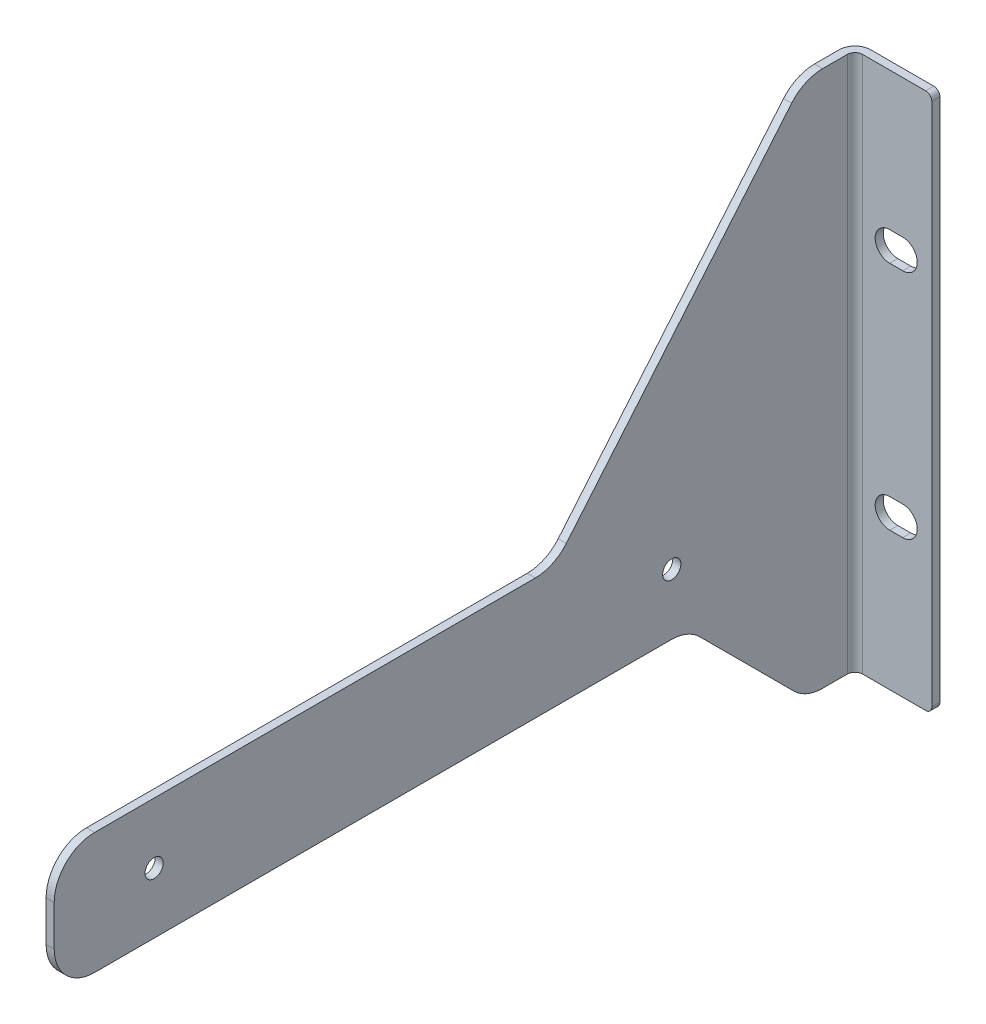
ISO-10303-21;
HEADER;
FILE_DESCRIPTION(('STEP AP214'),'2;1');
FILE_NAME('part.step','',(''),(''),'','','');
FILE_SCHEMA(('AUTOMOTIVE_DESIGN { 1 0 10303 214 1 1 1 1 }'));
ENDSEC;
DATA;
#1=APPLICATION_CONTEXT('core data for automotive mechanical design processes');
#2=APPLICATION_PROTOCOL_DEFINITION('international standard','automotive_design',2000,#1);
#3=PRODUCT_CONTEXT('',#1,'mechanical');
#4=PRODUCT('Part','Part','',(#3));
#5=PRODUCT_RELATED_PRODUCT_CATEGORY('part','',(#4));
#6=PRODUCT_DEFINITION_FORMATION('','',#4);
#7=PRODUCT_DEFINITION_CONTEXT('part definition',#1,'design');
#8=PRODUCT_DEFINITION('design','',#6,#7);
#9=PRODUCT_DEFINITION_SHAPE('','',#8);
#10=(LENGTH_UNIT() NAMED_UNIT(*) SI_UNIT(.MILLI.,.METRE.));
#11=(NAMED_UNIT(*) PLANE_ANGLE_UNIT() SI_UNIT($,.RADIAN.));
#12=(NAMED_UNIT(*) SI_UNIT($,.STERADIAN.) SOLID_ANGLE_UNIT());
#13=UNCERTAINTY_MEASURE_WITH_UNIT(LENGTH_MEASURE(1.E-05),#10,'distance_accuracy_value','');
#14=(GEOMETRIC_REPRESENTATION_CONTEXT(3) GLOBAL_UNCERTAINTY_ASSIGNED_CONTEXT((#13)) GLOBAL_UNIT_ASSIGNED_CONTEXT((#10,
#11,#12)) REPRESENTATION_CONTEXT('',''));
#15=CARTESIAN_POINT('',(0.,0.,0.));
#16=DIRECTION('',(0.,0.,1.));
#17=DIRECTION('',(1.,0.,0.));
#18=AXIS2_PLACEMENT_3D('',#15,#16,#17);
#19=CARTESIAN_POINT('',(0.,0.,2.));
#20=DIRECTION('',(0.,0.,1.));
#21=DIRECTION('',(1.,0.,0.));
#22=AXIS2_PLACEMENT_3D('',#19,#20,#21);
#23=PLANE('',#22);
#24=DIRECTION('',(1.,0.,0.));
#25=VECTOR('',#24,1.);
#26=CARTESIAN_POINT('',(19.,0.,1.99999999999999));
#27=LINE('',#26,#25);
#28=CARTESIAN_POINT('',(1.89999999999999,0.,1.99999999999999));
#29=VERTEX_POINT('',#28);
#30=CARTESIAN_POINT('',(17.5,0.,1.99999999999997));
#31=VERTEX_POINT('',#30);
#32=EDGE_CURVE('E378',#29,#31,#27,.T.);
#33=ORIENTED_EDGE('',*,*,#32,.T.);
#34=CARTESIAN_POINT('',(17.5,1.5,1.99999999999994));
#35=DIRECTION('',(0.,0.,1.));
#36=DIRECTION('',(1.,0.,0.));
#37=AXIS2_PLACEMENT_3D('',#34,#35,#36);
#38=CIRCLE('',#37,1.5);
#39=CARTESIAN_POINT('',(19.,1.5,1.99999999999993));
#40=VERTEX_POINT('',#39);
#41=EDGE_CURVE('E302',#40,#31,#38,.F.);
#42=ORIENTED_EDGE('',*,*,#41,.F.);
#43=DIRECTION('',(0.,1.,0.));
#44=VECTOR('',#43,1.);
#45=CARTESIAN_POINT('',(19.,132.7,1.99999999999993));
#46=LINE('',#45,#44);
#47=CARTESIAN_POINT('',(19.,131.2,1.99999999999993));
#48=VERTEX_POINT('',#47);
#49=EDGE_CURVE('E301',#40,#48,#46,.T.);
#50=ORIENTED_EDGE('',*,*,#49,.T.);
#51=CARTESIAN_POINT('',(17.5,131.2,1.99999999999994));
#52=DIRECTION('',(0.,0.,1.));
#53=DIRECTION('',(1.,0.,0.));
#54=AXIS2_PLACEMENT_3D('',#51,#52,#53);
#55=CIRCLE('',#54,1.5);
#56=CARTESIAN_POINT('',(17.5,132.7,1.99999999999994));
#57=VERTEX_POINT('',#56);
#58=EDGE_CURVE('E298',#57,#48,#55,.F.);
#59=ORIENTED_EDGE('',*,*,#58,.F.);
#60=DIRECTION('',(1.,0.,0.));
#61=VECTOR('',#60,1.);
#62=CARTESIAN_POINT('',(0.,132.7,1.99999999999994));
#63=LINE('',#62,#61);
#64=CARTESIAN_POINT('',(1.89999999999999,132.7,1.99999999999997));
#65=VERTEX_POINT('',#64);
#66=EDGE_CURVE('E316',#57,#65,#63,.F.);
#67=ORIENTED_EDGE('',*,*,#66,.T.);
#68=DIRECTION('',(0.,-1.,0.));
#69=VECTOR('',#68,1.);
#70=CARTESIAN_POINT('',(1.89999999999999,0.,1.99999999999999));
#71=LINE('',#70,#69);
#72=EDGE_CURVE('E363',#65,#29,#71,.T.);
#73=ORIENTED_EDGE('',*,*,#72,.T.);
#74=EDGE_LOOP('',(#33,#42,#50,#59,#67,#73));
#75=FACE_BOUND('',#74,.T.);
#76=CARTESIAN_POINT('',(11.8,94.925,1.99999999999995));
#77=DIRECTION('',(0.,0.,-1.));
#78=DIRECTION('',(-1.,0.,0.));
#79=AXIS2_PLACEMENT_3D('',#76,#77,#78);
#80=CIRCLE('',#79,3.60000000000002);
#81=CARTESIAN_POINT('',(11.8,98.525,1.99999999999997));
#82=VERTEX_POINT('',#81);
#83=CARTESIAN_POINT('',(11.8,91.325,1.99999999999995));
#84=VERTEX_POINT('',#83);
#85=EDGE_CURVE('E306',#82,#84,#80,.T.);
#86=ORIENTED_EDGE('',*,*,#85,.T.);
#87=DIRECTION('',(1.,0.,0.));
#88=VECTOR('',#87,1.);
#89=CARTESIAN_POINT('',(8.59999999999995,91.325,1.99999999999996));
#90=LINE('',#89,#88);
#91=CARTESIAN_POINT('',(8.59999999999995,91.325,1.99999999999996));
#92=VERTEX_POINT('',#91);
#93=EDGE_CURVE('E305',#84,#92,#90,.F.);
#94=ORIENTED_EDGE('',*,*,#93,.T.);
#95=CARTESIAN_POINT('',(8.59999999999995,94.925,1.99999999999997));
#96=DIRECTION('',(0.,0.,-1.));
#97=DIRECTION('',(-1.,0.,0.));
#98=AXIS2_PLACEMENT_3D('',#95,#96,#97);
#99=CIRCLE('',#98,3.60000000000002);
#100=CARTESIAN_POINT('',(8.59999999999995,98.525,1.99999999999997));
#101=VERTEX_POINT('',#100);
#102=EDGE_CURVE('E189',#92,#101,#99,.T.);
#103=ORIENTED_EDGE('',*,*,#102,.T.);
#104=DIRECTION('',(1.,0.,0.));
#105=VECTOR('',#104,1.);
#106=CARTESIAN_POINT('',(8.59999999999995,98.525,1.99999999999997));
#107=LINE('',#106,#105);
#108=EDGE_CURVE('E196',#101,#82,#107,.T.);
#109=ORIENTED_EDGE('',*,*,#108,.T.);
#110=EDGE_LOOP('',(#86,#94,#103,#109));
#111=FACE_BOUND('',#110,.T.);
#112=CARTESIAN_POINT('',(11.8,37.775,1.99999999999995));
#113=DIRECTION('',(0.,0.,-1.));
#114=DIRECTION('',(-1.,0.,0.));
#115=AXIS2_PLACEMENT_3D('',#112,#113,#114);
#116=CIRCLE('',#115,3.59999999999999);
#117=CARTESIAN_POINT('',(11.8,41.375,1.99999999999997));
#118=VERTEX_POINT('',#117);
#119=CARTESIAN_POINT('',(11.8,34.175,1.99999999999995));
#120=VERTEX_POINT('',#119);
#121=EDGE_CURVE('E187',#118,#120,#116,.T.);
#122=ORIENTED_EDGE('',*,*,#121,.T.);
#123=DIRECTION('',(1.,0.,0.));
#124=VECTOR('',#123,1.);
#125=CARTESIAN_POINT('',(8.59999999999995,34.175,1.99999999999996));
#126=LINE('',#125,#124);
#127=CARTESIAN_POINT('',(8.59999999999995,34.175,1.99999999999996));
#128=VERTEX_POINT('',#127);
#129=EDGE_CURVE('E182',#120,#128,#126,.F.);
#130=ORIENTED_EDGE('',*,*,#129,.T.);
#131=CARTESIAN_POINT('',(8.59999999999995,37.775,1.99999999999997));
#132=DIRECTION('',(0.,0.,-1.));
#133=DIRECTION('',(-1.,0.,0.));
#134=AXIS2_PLACEMENT_3D('',#131,#132,#133);
#135=CIRCLE('',#134,3.59999999999999);
#136=CARTESIAN_POINT('',(8.59999999999995,41.375,1.99999999999997));
#137=VERTEX_POINT('',#136);
#138=EDGE_CURVE('E20',#128,#137,#135,.T.);
#139=ORIENTED_EDGE('',*,*,#138,.T.);
#140=DIRECTION('',(1.,0.,0.));
#141=VECTOR('',#140,1.);
#142=CARTESIAN_POINT('',(8.59999999999995,41.375,1.99999999999997));
#143=LINE('',#142,#141);
#144=EDGE_CURVE('E198',#137,#118,#143,.T.);
#145=ORIENTED_EDGE('',*,*,#144,.T.);
#146=EDGE_LOOP('',(#122,#130,#139,#145));
#147=FACE_BOUND('',#146,.T.);
#148=ADVANCED_FACE('F17',(#75,#111,#147),#23,.T.);
#149=CARTESIAN_POINT('',(8.59999999999995,37.775,10.));
#150=DIRECTION('',(0.,0.,-1.));
#151=DIRECTION('',(-1.,0.,0.));
#152=AXIS2_PLACEMENT_3D('',#149,#150,#151);
#153=CYLINDRICAL_SURFACE('',#152,3.59999999999999);
#154=DIRECTION('',(0.,0.,-1.));
#155=VECTOR('',#154,1.);
#156=CARTESIAN_POINT('',(8.59999999999995,34.175,10.));
#157=LINE('',#156,#155);
#158=CARTESIAN_POINT('',(8.59999999999995,34.175,0.));
#159=VERTEX_POINT('',#158);
#160=EDGE_CURVE('E172',#128,#159,#157,.T.);
#161=ORIENTED_EDGE('',*,*,#160,.T.);
#162=CARTESIAN_POINT('',(8.59999999999995,37.775,0.));
#163=DIRECTION('',(0.,0.,-1.));
#164=DIRECTION('',(-1.,0.,0.));
#165=AXIS2_PLACEMENT_3D('',#162,#163,#164);
#166=CIRCLE('',#165,3.59999999999999);
#167=CARTESIAN_POINT('',(8.59999999999995,41.375,0.));
#168=VERTEX_POINT('',#167);
#169=EDGE_CURVE('E292',#159,#168,#166,.T.);
#170=ORIENTED_EDGE('',*,*,#169,.T.);
#171=DIRECTION('',(0.,0.,1.));
#172=VECTOR('',#171,1.);
#173=CARTESIAN_POINT('',(8.59999999999995,41.375,10.));
#174=LINE('',#173,#172);
#175=EDGE_CURVE('E174',#168,#137,#174,.T.);
#176=ORIENTED_EDGE('',*,*,#175,.T.);
#177=ORIENTED_EDGE('',*,*,#138,.F.);
#178=EDGE_LOOP('',(#161,#170,#176,#177));
#179=FACE_BOUND('',#178,.T.);
#180=ADVANCED_FACE('F170',(#179),#153,.F.);
#181=CARTESIAN_POINT('',(8.59999999999995,41.375,10.));
#182=DIRECTION('',(0.,1.,0.));
#183=DIRECTION('',(0.,0.,1.));
#184=AXIS2_PLACEMENT_3D('',#181,#182,#183);
#185=PLANE('',#184);
#186=ORIENTED_EDGE('',*,*,#175,.F.);
#187=DIRECTION('',(1.,0.,0.));
#188=VECTOR('',#187,1.);
#189=CARTESIAN_POINT('',(0.,41.375,0.));
#190=LINE('',#189,#188);
#191=CARTESIAN_POINT('',(11.8,41.375,0.));
#192=VERTEX_POINT('',#191);
#193=EDGE_CURVE('E291',#168,#192,#190,.T.);
#194=ORIENTED_EDGE('',*,*,#193,.T.);
#195=DIRECTION('',(0.,0.,-1.));
#196=VECTOR('',#195,1.);
#197=CARTESIAN_POINT('',(11.8,41.375,10.));
#198=LINE('',#197,#196);
#199=EDGE_CURVE('E200',#192,#118,#198,.F.);
#200=ORIENTED_EDGE('',*,*,#199,.T.);
#201=ORIENTED_EDGE('',*,*,#144,.F.);
#202=EDGE_LOOP('',(#186,#194,#200,#201));
#203=FACE_BOUND('',#202,.T.);
#204=ADVANCED_FACE('F767',(#203),#185,.F.);
#205=CARTESIAN_POINT('',(11.8,37.775,10.));
#206=DIRECTION('',(0.,0.,-1.));
#207=DIRECTION('',(-1.,0.,0.));
#208=AXIS2_PLACEMENT_3D('',#205,#206,#207);
#209=CYLINDRICAL_SURFACE('',#208,3.59999999999999);
#210=ORIENTED_EDGE('',*,*,#121,.F.);
#211=ORIENTED_EDGE('',*,*,#199,.F.);
#212=CARTESIAN_POINT('',(11.8,37.775,0.));
#213=DIRECTION('',(0.,0.,-1.));
#214=DIRECTION('',(-1.,0.,0.));
#215=AXIS2_PLACEMENT_3D('',#212,#213,#214);
#216=CIRCLE('',#215,3.59999999999999);
#217=CARTESIAN_POINT('',(11.8,34.175,0.));
#218=VERTEX_POINT('',#217);
#219=EDGE_CURVE('E288',#192,#218,#216,.T.);
#220=ORIENTED_EDGE('',*,*,#219,.T.);
#221=DIRECTION('',(0.,0.,-1.));
#222=VECTOR('',#221,1.);
#223=CARTESIAN_POINT('',(11.8,34.175,10.));
#224=LINE('',#223,#222);
#225=EDGE_CURVE('E186',#218,#120,#224,.F.);
#226=ORIENTED_EDGE('',*,*,#225,.T.);
#227=EDGE_LOOP('',(#210,#211,#220,#226));
#228=FACE_BOUND('',#227,.T.);
#229=ADVANCED_FACE('F759',(#228),#209,.F.);
#230=CARTESIAN_POINT('',(8.59999999999995,34.175,10.));
#231=DIRECTION('',(0.,-1.,0.));
#232=DIRECTION('',(0.,0.,-1.));
#233=AXIS2_PLACEMENT_3D('',#230,#231,#232);
#234=PLANE('',#233);
#235=ORIENTED_EDGE('',*,*,#225,.F.);
#236=DIRECTION('',(1.,0.,0.));
#237=VECTOR('',#236,1.);
#238=CARTESIAN_POINT('',(0.,34.175,0.));
#239=LINE('',#238,#237);
#240=EDGE_CURVE('E185',#218,#159,#239,.F.);
#241=ORIENTED_EDGE('',*,*,#240,.T.);
#242=ORIENTED_EDGE('',*,*,#160,.F.);
#243=ORIENTED_EDGE('',*,*,#129,.F.);
#244=EDGE_LOOP('',(#235,#241,#242,#243));
#245=FACE_BOUND('',#244,.T.);
#246=ADVANCED_FACE('F181',(#245),#234,.F.);
#247=CARTESIAN_POINT('',(8.59999999999995,94.925,10.));
#248=DIRECTION('',(0.,0.,-1.));
#249=DIRECTION('',(-1.,0.,0.));
#250=AXIS2_PLACEMENT_3D('',#247,#248,#249);
#251=CYLINDRICAL_SURFACE('',#250,3.60000000000002);
#252=DIRECTION('',(0.,0.,-1.));
#253=VECTOR('',#252,1.);
#254=CARTESIAN_POINT('',(8.59999999999995,91.325,10.));
#255=LINE('',#254,#253);
#256=CARTESIAN_POINT('',(8.59999999999995,91.325,0.));
#257=VERTEX_POINT('',#256);
#258=EDGE_CURVE('E307',#92,#257,#255,.T.);
#259=ORIENTED_EDGE('',*,*,#258,.T.);
#260=CARTESIAN_POINT('',(8.59999999999995,94.925,0.));
#261=DIRECTION('',(0.,0.,-1.));
#262=DIRECTION('',(-1.,0.,0.));
#263=AXIS2_PLACEMENT_3D('',#260,#261,#262);
#264=CIRCLE('',#263,3.60000000000002);
#265=CARTESIAN_POINT('',(8.59999999999995,98.525,0.));
#266=VERTEX_POINT('',#265);
#267=EDGE_CURVE('E285',#257,#266,#264,.T.);
#268=ORIENTED_EDGE('',*,*,#267,.T.);
#269=DIRECTION('',(0.,0.,1.));
#270=VECTOR('',#269,1.);
#271=CARTESIAN_POINT('',(8.59999999999995,98.525,10.));
#272=LINE('',#271,#270);
#273=EDGE_CURVE('E191',#266,#101,#272,.T.);
#274=ORIENTED_EDGE('',*,*,#273,.T.);
#275=ORIENTED_EDGE('',*,*,#102,.F.);
#276=EDGE_LOOP('',(#259,#268,#274,#275));
#277=FACE_BOUND('',#276,.T.);
#278=ADVANCED_FACE('F744',(#277),#251,.F.);
#279=CARTESIAN_POINT('',(8.59999999999995,98.525,10.));
#280=DIRECTION('',(0.,1.,0.));
#281=DIRECTION('',(0.,0.,1.));
#282=AXIS2_PLACEMENT_3D('',#279,#280,#281);
#283=PLANE('',#282);
#284=ORIENTED_EDGE('',*,*,#273,.F.);
#285=DIRECTION('',(1.,0.,0.));
#286=VECTOR('',#285,1.);
#287=CARTESIAN_POINT('',(0.,98.525,0.));
#288=LINE('',#287,#286);
#289=CARTESIAN_POINT('',(11.8,98.525,0.));
#290=VERTEX_POINT('',#289);
#291=EDGE_CURVE('E284',#266,#290,#288,.T.);
#292=ORIENTED_EDGE('',*,*,#291,.T.);
#293=DIRECTION('',(0.,0.,-1.));
#294=VECTOR('',#293,1.);
#295=CARTESIAN_POINT('',(11.8,98.525,10.));
#296=LINE('',#295,#294);
#297=EDGE_CURVE('E308',#290,#82,#296,.F.);
#298=ORIENTED_EDGE('',*,*,#297,.T.);
#299=ORIENTED_EDGE('',*,*,#108,.F.);
#300=EDGE_LOOP('',(#284,#292,#298,#299));
#301=FACE_BOUND('',#300,.T.);
#302=ADVANCED_FACE('F343',(#301),#283,.F.);
#303=CARTESIAN_POINT('',(11.8,94.925,10.));
#304=DIRECTION('',(0.,0.,-1.));
#305=DIRECTION('',(-1.,0.,0.));
#306=AXIS2_PLACEMENT_3D('',#303,#304,#305);
#307=CYLINDRICAL_SURFACE('',#306,3.60000000000002);
#308=ORIENTED_EDGE('',*,*,#85,.F.);
#309=ORIENTED_EDGE('',*,*,#297,.F.);
#310=CARTESIAN_POINT('',(11.8,94.925,0.));
#311=DIRECTION('',(0.,0.,-1.));
#312=DIRECTION('',(-1.,0.,0.));
#313=AXIS2_PLACEMENT_3D('',#310,#311,#312);
#314=CIRCLE('',#313,3.60000000000002);
#315=CARTESIAN_POINT('',(11.8,91.325,0.));
#316=VERTEX_POINT('',#315);
#317=EDGE_CURVE('E281',#290,#316,#314,.T.);
#318=ORIENTED_EDGE('',*,*,#317,.T.);
#319=DIRECTION('',(0.,0.,-1.));
#320=VECTOR('',#319,1.);
#321=CARTESIAN_POINT('',(11.8,91.325,10.));
#322=LINE('',#321,#320);
#323=EDGE_CURVE('E323',#316,#84,#322,.F.);
#324=ORIENTED_EDGE('',*,*,#323,.T.);
#325=EDGE_LOOP('',(#308,#309,#318,#324));
#326=FACE_BOUND('',#325,.T.);
#327=ADVANCED_FACE('F345',(#326),#307,.F.);
#328=CARTESIAN_POINT('',(8.59999999999995,91.325,10.));
#329=DIRECTION('',(0.,-1.,0.));
#330=DIRECTION('',(0.,0.,-1.));
#331=AXIS2_PLACEMENT_3D('',#328,#329,#330);
#332=PLANE('',#331);
#333=ORIENTED_EDGE('',*,*,#323,.F.);
#334=DIRECTION('',(1.,0.,0.));
#335=VECTOR('',#334,1.);
#336=CARTESIAN_POINT('',(0.,91.325,0.));
#337=LINE('',#336,#335);
#338=EDGE_CURVE('E280',#316,#257,#337,.F.);
#339=ORIENTED_EDGE('',*,*,#338,.T.);
#340=ORIENTED_EDGE('',*,*,#258,.F.);
#341=ORIENTED_EDGE('',*,*,#93,.F.);
#342=EDGE_LOOP('',(#333,#339,#340,#341));
#343=FACE_BOUND('',#342,.T.);
#344=ADVANCED_FACE('F722',(#343),#332,.F.);
#345=CARTESIAN_POINT('',(17.5,1.5,0.));
#346=DIRECTION('',(0.,0.,1.));
#347=DIRECTION('',(1.,0.,0.));
#348=AXIS2_PLACEMENT_3D('',#345,#346,#347);
#349=CYLINDRICAL_SURFACE('',#348,1.5);
#350=ORIENTED_EDGE('',*,*,#41,.T.);
#351=DIRECTION('',(0.,0.,1.));
#352=VECTOR('',#351,1.);
#353=CARTESIAN_POINT('',(17.5,0.,0.));
#354=LINE('',#353,#352);
#355=CARTESIAN_POINT('',(17.5,0.,0.));
#356=VERTEX_POINT('',#355);
#357=EDGE_CURVE('E319',#31,#356,#354,.F.);
#358=ORIENTED_EDGE('',*,*,#357,.T.);
#359=CARTESIAN_POINT('',(17.5,1.5,0.));
#360=DIRECTION('',(0.,0.,1.));
#361=DIRECTION('',(1.,0.,0.));
#362=AXIS2_PLACEMENT_3D('',#359,#360,#361);
#363=CIRCLE('',#362,1.5);
#364=CARTESIAN_POINT('',(19.,1.5,0.));
#365=VERTEX_POINT('',#364);
#366=EDGE_CURVE('E277',#356,#365,#363,.T.);
#367=ORIENTED_EDGE('',*,*,#366,.T.);
#368=DIRECTION('',(0.,0.,1.));
#369=VECTOR('',#368,1.);
#370=CARTESIAN_POINT('',(19.,1.5,0.));
#371=LINE('',#370,#369);
#372=EDGE_CURVE('E304',#365,#40,#371,.T.);
#373=ORIENTED_EDGE('',*,*,#372,.T.);
#374=EDGE_LOOP('',(#350,#358,#367,#373));
#375=FACE_BOUND('',#374,.T.);
#376=ADVANCED_FACE('F399',(#375),#349,.T.);
#377=CARTESIAN_POINT('',(19.,132.7,0.));
#378=DIRECTION('',(-1.,0.,0.));
#379=DIRECTION('',(0.,0.,1.));
#380=AXIS2_PLACEMENT_3D('',#377,#378,#379);
#381=PLANE('',#380);
#382=DIRECTION('',(0.,0.,1.));
#383=VECTOR('',#382,1.);
#384=CARTESIAN_POINT('',(19.,131.2,0.));
#385=LINE('',#384,#383);
#386=CARTESIAN_POINT('',(19.,131.2,0.));
#387=VERTEX_POINT('',#386);
#388=EDGE_CURVE('E300',#48,#387,#385,.F.);
#389=ORIENTED_EDGE('',*,*,#388,.F.);
#390=ORIENTED_EDGE('',*,*,#49,.F.);
#391=ORIENTED_EDGE('',*,*,#372,.F.);
#392=DIRECTION('',(0.,1.,0.));
#393=VECTOR('',#392,1.);
#394=CARTESIAN_POINT('',(19.,0.,0.));
#395=LINE('',#394,#393);
#396=EDGE_CURVE('E276',#365,#387,#395,.T.);
#397=ORIENTED_EDGE('',*,*,#396,.T.);
#398=EDGE_LOOP('',(#389,#390,#391,#397));
#399=FACE_BOUND('',#398,.T.);
#400=ADVANCED_FACE('F396',(#399),#381,.F.);
#401=CARTESIAN_POINT('',(17.5,131.2,0.));
#402=DIRECTION('',(0.,0.,1.));
#403=DIRECTION('',(1.,0.,0.));
#404=AXIS2_PLACEMENT_3D('',#401,#402,#403);
#405=CYLINDRICAL_SURFACE('',#404,1.5);
#406=ORIENTED_EDGE('',*,*,#58,.T.);
#407=ORIENTED_EDGE('',*,*,#388,.T.);
#408=CARTESIAN_POINT('',(17.5,131.2,0.));
#409=DIRECTION('',(0.,0.,1.));
#410=DIRECTION('',(1.,0.,0.));
#411=AXIS2_PLACEMENT_3D('',#408,#409,#410);
#412=CIRCLE('',#411,1.5);
#413=CARTESIAN_POINT('',(17.5,132.7,0.));
#414=VERTEX_POINT('',#413);
#415=EDGE_CURVE('E272',#387,#414,#412,.T.);
#416=ORIENTED_EDGE('',*,*,#415,.T.);
#417=DIRECTION('',(0.,0.,-1.));
#418=VECTOR('',#417,1.);
#419=CARTESIAN_POINT('',(17.5,132.7,0.));
#420=LINE('',#419,#418);
#421=EDGE_CURVE('E320',#414,#57,#420,.F.);
#422=ORIENTED_EDGE('',*,*,#421,.T.);
#423=EDGE_LOOP('',(#406,#407,#416,#422));
#424=FACE_BOUND('',#423,.T.);
#425=ADVANCED_FACE('F387',(#424),#405,.T.);
#426=CARTESIAN_POINT('',(1.89999999999999,0.,3.89999999999999));
#427=DIRECTION('',(0.,-1.,0.));
#428=DIRECTION('',(0.,0.,-1.));
#429=AXIS2_PLACEMENT_3D('',#426,#427,#428);
#430=CYLINDRICAL_SURFACE('',#429,1.9);
#431=CARTESIAN_POINT('',(1.89999999999999,0.,3.89999999999999));
#432=DIRECTION('',(0.,-1.,0.));
#433=DIRECTION('',(0.,0.,-1.));
#434=AXIS2_PLACEMENT_3D('',#431,#432,#433);
#435=CIRCLE('',#434,1.9);
#436=CARTESIAN_POINT('',(0.,0.,3.89999999999999));
#437=VERTEX_POINT('',#436);
#438=EDGE_CURVE('E268',#437,#29,#435,.T.);
#439=ORIENTED_EDGE('',*,*,#438,.T.);
#440=ORIENTED_EDGE('',*,*,#72,.F.);
#441=CARTESIAN_POINT('',(1.89999999999999,132.7,3.89999999999999));
#442=DIRECTION('',(0.,-1.,0.));
#443=DIRECTION('',(0.,0.,-1.));
#444=AXIS2_PLACEMENT_3D('',#441,#442,#443);
#445=CIRCLE('',#444,1.9);
#446=CARTESIAN_POINT('',(0.,132.7,3.89999999999999));
#447=VERTEX_POINT('',#446);
#448=EDGE_CURVE('E294',#447,#65,#445,.T.);
#449=ORIENTED_EDGE('',*,*,#448,.F.);
#450=DIRECTION('',(0.,1.,0.));
#451=VECTOR('',#450,1.);
#452=CARTESIAN_POINT('',(0.,10.,3.89999999999999));
#453=LINE('',#452,#451);
#454=EDGE_CURVE('E297',#437,#447,#453,.T.);
#455=ORIENTED_EDGE('',*,*,#454,.F.);
#456=EDGE_LOOP('',(#439,#440,#449,#455));
#457=FACE_BOUND('',#456,.T.);
#458=ADVANCED_FACE('F460',(#457),#430,.F.);
#459=CARTESIAN_POINT('',(0.,10.,10.));
#460=DIRECTION('',(1.,0.,0.));
#461=DIRECTION('',(0.,0.,-1.));
#462=AXIS2_PLACEMENT_3D('',#459,#460,#461);
#463=PLANE('',#462);
#464=DIRECTION('',(0.,0.,-1.));
#465=VECTOR('',#464,1.);
#466=CARTESIAN_POINT('',(0.,0.,0.));
#467=LINE('',#466,#465);
#468=CARTESIAN_POINT('',(0.,0.,10.));
#469=VERTEX_POINT('',#468);
#470=EDGE_CURVE('E360',#437,#469,#467,.F.);
#471=ORIENTED_EDGE('',*,*,#470,.F.);
#472=ORIENTED_EDGE('',*,*,#454,.T.);
#473=DIRECTION('',(0.,0.,1.));
#474=VECTOR('',#473,1.);
#475=CARTESIAN_POINT('',(0.,132.7,10.));
#476=LINE('',#475,#474);
#477=CARTESIAN_POINT('',(0.,132.7,10.));
#478=VERTEX_POINT('',#477);
#479=EDGE_CURVE('E261',#478,#447,#476,.F.);
#480=ORIENTED_EDGE('',*,*,#479,.F.);
#481=CARTESIAN_POINT('',(0.,122.7,10.));
#482=DIRECTION('',(1.,0.,0.));
#483=DIRECTION('',(0.,0.,-1.));
#484=AXIS2_PLACEMENT_3D('',#481,#482,#483);
#485=CIRCLE('',#484,9.99999999999998);
#486=CARTESIAN_POINT('',(0.,129.127876096865,17.6604444311898));
#487=VERTEX_POINT('',#486);
#488=EDGE_CURVE('E258',#487,#478,#485,.F.);
#489=ORIENTED_EDGE('',*,*,#488,.F.);
#490=DIRECTION('',(0.,-0.766044443118981,0.642787609686535));
#491=VECTOR('',#490,1.);
#492=CARTESIAN_POINT('',(0.,62.7221239031346,73.3814866049985));
#493=LINE('',#492,#491);
#494=CARTESIAN_POINT('',(0.,62.7221239031346,73.3814866049985));
#495=VERTEX_POINT('',#494);
#496=EDGE_CURVE('E371',#495,#487,#493,.F.);
#497=ORIENTED_EDGE('',*,*,#496,.F.);
#498=CARTESIAN_POINT('',(0.,69.15,81.0419310361883));
#499=DIRECTION('',(1.,0.,0.));
#500=DIRECTION('',(0.,0.,-1.));
#501=AXIS2_PLACEMENT_3D('',#498,#499,#500);
#502=CIRCLE('',#501,10.);
#503=CARTESIAN_POINT('',(0.,59.15,81.0419310361883));
#504=VERTEX_POINT('',#503);
#505=EDGE_CURVE('E253',#495,#504,#502,.F.);
#506=ORIENTED_EDGE('',*,*,#505,.T.);
#507=DIRECTION('',(0.,0.,1.));
#508=VECTOR('',#507,1.);
#509=CARTESIAN_POINT('',(0.,59.15,190.));
#510=LINE('',#509,#508);
#511=CARTESIAN_POINT('',(0.,59.15,190.));
#512=VERTEX_POINT('',#511);
#513=EDGE_CURVE('E256',#512,#504,#510,.F.);
#514=ORIENTED_EDGE('',*,*,#513,.F.);
#515=CARTESIAN_POINT('',(0.,49.15,190.));
#516=DIRECTION('',(1.,0.,0.));
#517=DIRECTION('',(0.,0.,-1.));
#518=AXIS2_PLACEMENT_3D('',#515,#516,#517);
#519=CIRCLE('',#518,10.);
#520=CARTESIAN_POINT('',(0.,49.15,200.));
#521=VERTEX_POINT('',#520);
#522=EDGE_CURVE('E249',#521,#512,#519,.F.);
#523=ORIENTED_EDGE('',*,*,#522,.F.);
#524=DIRECTION('',(0.,1.,0.));
#525=VECTOR('',#524,1.);
#526=CARTESIAN_POINT('',(0.,39.15,200.));
#527=LINE('',#526,#525);
#528=CARTESIAN_POINT('',(0.,39.15,200.));
#529=VERTEX_POINT('',#528);
#530=EDGE_CURVE('E368',#529,#521,#527,.T.);
#531=ORIENTED_EDGE('',*,*,#530,.F.);
#532=CARTESIAN_POINT('',(0.,39.15,190.));
#533=DIRECTION('',(1.,0.,0.));
#534=DIRECTION('',(0.,0.,-1.));
#535=AXIS2_PLACEMENT_3D('',#532,#533,#534);
#536=CIRCLE('',#535,10.);
#537=CARTESIAN_POINT('',(0.,29.15,190.));
#538=VERTEX_POINT('',#537);
#539=EDGE_CURVE('E245',#538,#529,#536,.F.);
#540=ORIENTED_EDGE('',*,*,#539,.F.);
#541=DIRECTION('',(0.,0.,-1.));
#542=VECTOR('',#541,1.);
#543=CARTESIAN_POINT('',(0.,29.15,47.4342712474617));
#544=LINE('',#543,#542);
#545=CARTESIAN_POINT('',(0.,29.15,47.4342712474617));
#546=VERTEX_POINT('',#545);
#547=EDGE_CURVE('E365',#546,#538,#544,.F.);
#548=ORIENTED_EDGE('',*,*,#547,.F.);
#549=CARTESIAN_POINT('',(0.,19.15,47.4342712474616));
#550=DIRECTION('',(1.,0.,0.));
#551=DIRECTION('',(0.,0.,-1.));
#552=AXIS2_PLACEMENT_3D('',#549,#550,#551);
#553=CIRCLE('',#552,10.);
#554=CARTESIAN_POINT('',(0.,26.2210678118654,40.3632034355961));
#555=VERTEX_POINT('',#554);
#556=EDGE_CURVE('E240',#546,#555,#553,.F.);
#557=ORIENTED_EDGE('',*,*,#556,.T.);
#558=DIRECTION('',(0.,-0.707106781186551,-0.707106781186544));
#559=VECTOR('',#558,1.);
#560=CARTESIAN_POINT('',(0.,2.92893218813456,17.0710678118655));
#561=LINE('',#560,#559);
#562=CARTESIAN_POINT('',(0.,2.92893218813456,17.0710678118655));
#563=VERTEX_POINT('',#562);
#564=EDGE_CURVE('E243',#563,#555,#561,.F.);
#565=ORIENTED_EDGE('',*,*,#564,.F.);
#566=CARTESIAN_POINT('',(0.,10.,10.));
#567=DIRECTION('',(1.,0.,0.));
#568=DIRECTION('',(0.,0.,-1.));
#569=AXIS2_PLACEMENT_3D('',#566,#567,#568);
#570=CIRCLE('',#569,10.);
#571=EDGE_CURVE('E236',#469,#563,#570,.F.);
#572=ORIENTED_EDGE('',*,*,#571,.F.);
#573=EDGE_LOOP('',(#471,#472,#480,#489,#497,#506,#514,#523,#531,#540,#548,#557,#565,#572));
#574=FACE_BOUND('',#573,.T.);
#575=CARTESIAN_POINT('',(0.,44.15,175.3));
#576=DIRECTION('',(1.,0.,0.));
#577=DIRECTION('',(0.,0.,-1.));
#578=AXIS2_PLACEMENT_3D('',#575,#576,#577);
#579=CIRCLE('',#578,2.25);
#580=CARTESIAN_POINT('',(0.,44.15,173.05));
#581=VERTEX_POINT('',#580);
#582=EDGE_CURVE('E265',#581,#581,#579,.F.);
#583=ORIENTED_EDGE('',*,*,#582,.T.);
#584=EDGE_LOOP('',(#583));
#585=FACE_BOUND('',#584,.T.);
#586=CARTESIAN_POINT('',(0.,44.15,47.3));
#587=DIRECTION('',(1.,0.,0.));
#588=DIRECTION('',(0.,0.,-1.));
#589=AXIS2_PLACEMENT_3D('',#586,#587,#588);
#590=CIRCLE('',#589,2.25);
#591=CARTESIAN_POINT('',(0.,44.15,45.05));
#592=VERTEX_POINT('',#591);
#593=EDGE_CURVE('E262',#592,#592,#590,.F.);
#594=ORIENTED_EDGE('',*,*,#593,.T.);
#595=EDGE_LOOP('',(#594));
#596=FACE_BOUND('',#595,.T.);
#597=ADVANCED_FACE('F463',(#574,#585,#596),#463,.T.);
#598=CARTESIAN_POINT('',(0.,0.,0.));
#599=DIRECTION('',(0.,0.,1.));
#600=DIRECTION('',(1.,0.,0.));
#601=AXIS2_PLACEMENT_3D('',#598,#599,#600);
#602=PLANE('',#601);
#603=DIRECTION('',(0.,-1.,0.));
#604=VECTOR('',#603,1.);
#605=CARTESIAN_POINT('',(1.89999999999999,0.,0.));
#606=LINE('',#605,#604);
#607=CARTESIAN_POINT('',(1.89999999999999,132.7,0.));
#608=VERTEX_POINT('',#607);
#609=CARTESIAN_POINT('',(1.89999999999999,0.,0.));
#610=VERTEX_POINT('',#609);
#611=EDGE_CURVE('E232',#608,#610,#606,.T.);
#612=ORIENTED_EDGE('',*,*,#611,.F.);
#613=DIRECTION('',(1.,0.,0.));
#614=VECTOR('',#613,1.);
#615=CARTESIAN_POINT('',(0.,132.7,0.));
#616=LINE('',#615,#614);
#617=EDGE_CURVE('E275',#414,#608,#616,.F.);
#618=ORIENTED_EDGE('',*,*,#617,.F.);
#619=ORIENTED_EDGE('',*,*,#415,.F.);
#620=ORIENTED_EDGE('',*,*,#396,.F.);
#621=ORIENTED_EDGE('',*,*,#366,.F.);
#622=DIRECTION('',(1.,0.,0.));
#623=VECTOR('',#622,1.);
#624=CARTESIAN_POINT('',(0.,0.,0.));
#625=LINE('',#624,#623);
#626=EDGE_CURVE('E271',#610,#356,#625,.T.);
#627=ORIENTED_EDGE('',*,*,#626,.F.);
#628=EDGE_LOOP('',(#612,#618,#619,#620,#621,#627));
#629=FACE_BOUND('',#628,.T.);
#630=ORIENTED_EDGE('',*,*,#317,.F.);
#631=ORIENTED_EDGE('',*,*,#291,.F.);
#632=ORIENTED_EDGE('',*,*,#267,.F.);
#633=ORIENTED_EDGE('',*,*,#338,.F.);
#634=EDGE_LOOP('',(#630,#631,#632,#633));
#635=FACE_BOUND('',#634,.T.);
#636=ORIENTED_EDGE('',*,*,#219,.F.);
#637=ORIENTED_EDGE('',*,*,#193,.F.);
#638=ORIENTED_EDGE('',*,*,#169,.F.);
#639=ORIENTED_EDGE('',*,*,#240,.F.);
#640=EDGE_LOOP('',(#636,#637,#638,#639));
#641=FACE_BOUND('',#640,.T.);
#642=ADVANCED_FACE('F348',(#629,#635,#641),#602,.F.);
#643=CARTESIAN_POINT('',(-2.,44.15,175.3));
#644=DIRECTION('',(1.,0.,0.));
#645=DIRECTION('',(0.,0.,-1.));
#646=AXIS2_PLACEMENT_3D('',#643,#644,#645);
#647=CYLINDRICAL_SURFACE('',#646,2.25);
#648=ORIENTED_EDGE('',*,*,#582,.F.);
#649=EDGE_LOOP('',(#648));
#650=FACE_BOUND('',#649,.T.);
#651=CARTESIAN_POINT('',(-2.,44.15,175.3));
#652=DIRECTION('',(1.,0.,0.));
#653=DIRECTION('',(0.,0.,-1.));
#654=AXIS2_PLACEMENT_3D('',#651,#652,#653);
#655=CIRCLE('',#654,2.25);
#656=CARTESIAN_POINT('',(-2.,44.15,173.05));
#657=VERTEX_POINT('',#656);
#658=EDGE_CURVE('E228',#657,#657,#655,.F.);
#659=ORIENTED_EDGE('',*,*,#658,.T.);
#660=EDGE_LOOP('',(#659));
#661=FACE_BOUND('',#660,.T.);
#662=ADVANCED_FACE('F670',(#650,#661),#647,.F.);
#663=CARTESIAN_POINT('',(-2.,44.15,47.3));
#664=DIRECTION('',(1.,0.,0.));
#665=DIRECTION('',(0.,0.,-1.));
#666=AXIS2_PLACEMENT_3D('',#663,#664,#665);
#667=CYLINDRICAL_SURFACE('',#666,2.25);
#668=ORIENTED_EDGE('',*,*,#593,.F.);
#669=EDGE_LOOP('',(#668));
#670=FACE_BOUND('',#669,.T.);
#671=CARTESIAN_POINT('',(-2.,44.15,47.3));
#672=DIRECTION('',(1.,0.,0.));
#673=DIRECTION('',(0.,0.,-1.));
#674=AXIS2_PLACEMENT_3D('',#671,#672,#673);
#675=CIRCLE('',#674,2.25);
#676=CARTESIAN_POINT('',(-2.,44.15,45.05));
#677=VERTEX_POINT('',#676);
#678=EDGE_CURVE('E225',#677,#677,#675,.F.);
#679=ORIENTED_EDGE('',*,*,#678,.T.);
#680=EDGE_LOOP('',(#679));
#681=FACE_BOUND('',#680,.T.);
#682=ADVANCED_FACE('F544',(#670,#681),#667,.F.);
#683=CARTESIAN_POINT('',(-2.,132.7,10.));
#684=DIRECTION('',(0.,1.,0.));
#685=DIRECTION('',(0.,0.,1.));
#686=AXIS2_PLACEMENT_3D('',#683,#684,#685);
#687=PLANE('',#686);
#688=DIRECTION('',(1.,0.,0.));
#689=VECTOR('',#688,1.);
#690=CARTESIAN_POINT('',(-2.,132.7,10.));
#691=LINE('',#690,#689);
#692=CARTESIAN_POINT('',(-2.,132.7,10.));
#693=VERTEX_POINT('',#692);
#694=EDGE_CURVE('E260',#478,#693,#691,.F.);
#695=ORIENTED_EDGE('',*,*,#694,.F.);
#696=ORIENTED_EDGE('',*,*,#479,.T.);
#697=ORIENTED_EDGE('',*,*,#448,.T.);
#698=ORIENTED_EDGE('',*,*,#66,.F.);
#699=ORIENTED_EDGE('',*,*,#421,.F.);
#700=ORIENTED_EDGE('',*,*,#617,.T.);
#701=CARTESIAN_POINT('',(1.89999999999999,132.7,3.89999999999999));
#702=DIRECTION('',(0.,-1.,0.));
#703=DIRECTION('',(0.,0.,-1.));
#704=AXIS2_PLACEMENT_3D('',#701,#702,#703);
#705=CIRCLE('',#704,3.9);
#706=CARTESIAN_POINT('',(-2.,132.7,3.89999999999999));
#707=VERTEX_POINT('',#706);
#708=EDGE_CURVE('E233',#707,#608,#705,.T.);
#709=ORIENTED_EDGE('',*,*,#708,.F.);
#710=DIRECTION('',(0.,0.,-1.));
#711=VECTOR('',#710,1.);
#712=CARTESIAN_POINT('',(-2.,132.7,10.));
#713=LINE('',#712,#711);
#714=EDGE_CURVE('E224',#707,#693,#713,.F.);
#715=ORIENTED_EDGE('',*,*,#714,.T.);
#716=EDGE_LOOP('',(#695,#696,#697,#698,#699,#700,#709,#715));
#717=FACE_BOUND('',#716,.T.);
#718=ADVANCED_FACE('F452',(#717),#687,.T.);
#719=CARTESIAN_POINT('',(-2.,122.7,10.));
#720=DIRECTION('',(1.,0.,0.));
#721=DIRECTION('',(0.,0.,-1.));
#722=AXIS2_PLACEMENT_3D('',#719,#720,#721);
#723=CYLINDRICAL_SURFACE('',#722,9.99999999999998);
#724=CARTESIAN_POINT('',(-2.,122.7,10.));
#725=DIRECTION('',(1.,0.,0.));
#726=DIRECTION('',(0.,0.,-1.));
#727=AXIS2_PLACEMENT_3D('',#724,#725,#726);
#728=CIRCLE('',#727,9.99999999999998);
#729=CARTESIAN_POINT('',(-2.,129.127876096865,17.6604444311898));
#730=VERTEX_POINT('',#729);
#731=EDGE_CURVE('E221',#693,#730,#728,.T.);
#732=ORIENTED_EDGE('',*,*,#731,.T.);
#733=DIRECTION('',(1.,0.,0.));
#734=VECTOR('',#733,1.);
#735=CARTESIAN_POINT('',(-2.,129.127876096865,17.6604444311898));
#736=LINE('',#735,#734);
#737=EDGE_CURVE('E373',#487,#730,#736,.F.);
#738=ORIENTED_EDGE('',*,*,#737,.F.);
#739=ORIENTED_EDGE('',*,*,#488,.T.);
#740=ORIENTED_EDGE('',*,*,#694,.T.);
#741=EDGE_LOOP('',(#732,#738,#739,#740));
#742=FACE_BOUND('',#741,.T.);
#743=ADVANCED_FACE('F534',(#742),#723,.T.);
#744=CARTESIAN_POINT('',(-2.,62.7221239031346,73.3814866049985));
#745=DIRECTION('',(0.,0.642787609686535,0.766044443118981));
#746=DIRECTION('',(0.,-0.766044443118981,0.642787609686535));
#747=AXIS2_PLACEMENT_3D('',#744,#745,#746);
#748=PLANE('',#747);
#749=DIRECTION('',(0.,-0.766044443118982,0.642787609686535));
#750=VECTOR('',#749,1.);
#751=CARTESIAN_POINT('',(-2.,129.127876096865,17.6604444311898));
#752=LINE('',#751,#750);
#753=CARTESIAN_POINT('',(-2.,62.7221239031346,73.3814866049985));
#754=VERTEX_POINT('',#753);
#755=EDGE_CURVE('E220',#730,#754,#752,.T.);
#756=ORIENTED_EDGE('',*,*,#755,.T.);
#757=DIRECTION('',(1.,0.,0.));
#758=VECTOR('',#757,1.);
#759=CARTESIAN_POINT('',(-2.,62.7221239031346,73.3814866049985));
#760=LINE('',#759,#758);
#761=EDGE_CURVE('E257',#754,#495,#760,.T.);
#762=ORIENTED_EDGE('',*,*,#761,.T.);
#763=ORIENTED_EDGE('',*,*,#496,.T.);
#764=ORIENTED_EDGE('',*,*,#737,.T.);
#765=EDGE_LOOP('',(#756,#762,#763,#764));
#766=FACE_BOUND('',#765,.T.);
#767=ADVANCED_FACE('F530',(#766),#748,.T.);
#768=CARTESIAN_POINT('',(-2.,69.15,81.0419310361883));
#769=DIRECTION('',(1.,0.,0.));
#770=DIRECTION('',(0.,0.,-1.));
#771=AXIS2_PLACEMENT_3D('',#768,#769,#770);
#772=CYLINDRICAL_SURFACE('',#771,10.);
#773=ORIENTED_EDGE('',*,*,#761,.F.);
#774=CARTESIAN_POINT('',(-2.,69.15,81.0419310361883));
#775=DIRECTION('',(1.,0.,0.));
#776=DIRECTION('',(0.,0.,-1.));
#777=AXIS2_PLACEMENT_3D('',#774,#775,#776);
#778=CIRCLE('',#777,10.);
#779=CARTESIAN_POINT('',(-2.,59.15,81.0419310361883));
#780=VERTEX_POINT('',#779);
#781=EDGE_CURVE('E217',#754,#780,#778,.F.);
#782=ORIENTED_EDGE('',*,*,#781,.T.);
#783=DIRECTION('',(1.,0.,0.));
#784=VECTOR('',#783,1.);
#785=CARTESIAN_POINT('',(-2.,59.15,81.0419310361883));
#786=LINE('',#785,#784);
#787=EDGE_CURVE('E252',#504,#780,#786,.F.);
#788=ORIENTED_EDGE('',*,*,#787,.F.);
#789=ORIENTED_EDGE('',*,*,#505,.F.);
#790=EDGE_LOOP('',(#773,#782,#788,#789));
#791=FACE_BOUND('',#790,.T.);
#792=ADVANCED_FACE('F524',(#791),#772,.F.);
#793=CARTESIAN_POINT('',(-2.,59.15,190.));
#794=DIRECTION('',(0.,1.,0.));
#795=DIRECTION('',(0.,0.,1.));
#796=AXIS2_PLACEMENT_3D('',#793,#794,#795);
#797=PLANE('',#796);
#798=DIRECTION('',(0.,0.,-1.));
#799=VECTOR('',#798,1.);
#800=CARTESIAN_POINT('',(-2.,59.15,10.));
#801=LINE('',#800,#799);
#802=CARTESIAN_POINT('',(-2.,59.15,190.));
#803=VERTEX_POINT('',#802);
#804=EDGE_CURVE('E216',#780,#803,#801,.F.);
#805=ORIENTED_EDGE('',*,*,#804,.T.);
#806=DIRECTION('',(1.,0.,0.));
#807=VECTOR('',#806,1.);
#808=CARTESIAN_POINT('',(-2.,59.15,190.));
#809=LINE('',#808,#807);
#810=EDGE_CURVE('E251',#512,#803,#809,.F.);
#811=ORIENTED_EDGE('',*,*,#810,.F.);
#812=ORIENTED_EDGE('',*,*,#513,.T.);
#813=ORIENTED_EDGE('',*,*,#787,.T.);
#814=EDGE_LOOP('',(#805,#811,#812,#813));
#815=FACE_BOUND('',#814,.T.);
#816=ADVANCED_FACE('F517',(#815),#797,.T.);
#817=CARTESIAN_POINT('',(-2.,49.15,190.));
#818=DIRECTION('',(1.,0.,0.));
#819=DIRECTION('',(0.,0.,-1.));
#820=AXIS2_PLACEMENT_3D('',#817,#818,#819);
#821=CYLINDRICAL_SURFACE('',#820,10.);
#822=CARTESIAN_POINT('',(-2.,49.15,190.));
#823=DIRECTION('',(1.,0.,0.));
#824=DIRECTION('',(0.,0.,-1.));
#825=AXIS2_PLACEMENT_3D('',#822,#823,#824);
#826=CIRCLE('',#825,10.);
#827=CARTESIAN_POINT('',(-2.,49.15,200.));
#828=VERTEX_POINT('',#827);
#829=EDGE_CURVE('E213',#803,#828,#826,.T.);
#830=ORIENTED_EDGE('',*,*,#829,.T.);
#831=DIRECTION('',(1.,0.,0.));
#832=VECTOR('',#831,1.);
#833=CARTESIAN_POINT('',(-2.,49.15,200.));
#834=LINE('',#833,#832);
#835=EDGE_CURVE('E248',#521,#828,#834,.F.);
#836=ORIENTED_EDGE('',*,*,#835,.F.);
#837=ORIENTED_EDGE('',*,*,#522,.T.);
#838=ORIENTED_EDGE('',*,*,#810,.T.);
#839=EDGE_LOOP('',(#830,#836,#837,#838));
#840=FACE_BOUND('',#839,.T.);
#841=ADVANCED_FACE('F509',(#840),#821,.T.);
#842=CARTESIAN_POINT('',(-2.,39.15,200.));
#843=DIRECTION('',(0.,0.,1.));
#844=DIRECTION('',(1.,0.,0.));
#845=AXIS2_PLACEMENT_3D('',#842,#843,#844);
#846=PLANE('',#845);
#847=DIRECTION('',(0.,1.,0.));
#848=VECTOR('',#847,1.);
#849=CARTESIAN_POINT('',(-2.,10.,200.));
#850=LINE('',#849,#848);
#851=CARTESIAN_POINT('',(-2.,39.15,200.));
#852=VERTEX_POINT('',#851);
#853=EDGE_CURVE('E212',#828,#852,#850,.F.);
#854=ORIENTED_EDGE('',*,*,#853,.T.);
#855=DIRECTION('',(1.,0.,0.));
#856=VECTOR('',#855,1.);
#857=CARTESIAN_POINT('',(-2.,39.15,200.));
#858=LINE('',#857,#856);
#859=EDGE_CURVE('E247',#529,#852,#858,.F.);
#860=ORIENTED_EDGE('',*,*,#859,.F.);
#861=ORIENTED_EDGE('',*,*,#530,.T.);
#862=ORIENTED_EDGE('',*,*,#835,.T.);
#863=EDGE_LOOP('',(#854,#860,#861,#862));
#864=FACE_BOUND('',#863,.T.);
#865=ADVANCED_FACE('F503',(#864),#846,.T.);
#866=CARTESIAN_POINT('',(-2.,39.15,190.));
#867=DIRECTION('',(1.,0.,0.));
#868=DIRECTION('',(0.,0.,-1.));
#869=AXIS2_PLACEMENT_3D('',#866,#867,#868);
#870=CYLINDRICAL_SURFACE('',#869,10.);
#871=CARTESIAN_POINT('',(-2.,39.15,190.));
#872=DIRECTION('',(1.,0.,0.));
#873=DIRECTION('',(0.,0.,-1.));
#874=AXIS2_PLACEMENT_3D('',#871,#872,#873);
#875=CIRCLE('',#874,10.);
#876=CARTESIAN_POINT('',(-2.,29.15,190.));
#877=VERTEX_POINT('',#876);
#878=EDGE_CURVE('E209',#852,#877,#875,.T.);
#879=ORIENTED_EDGE('',*,*,#878,.T.);
#880=DIRECTION('',(1.,0.,0.));
#881=VECTOR('',#880,1.);
#882=CARTESIAN_POINT('',(-2.,29.15,190.));
#883=LINE('',#882,#881);
#884=EDGE_CURVE('E367',#538,#877,#883,.F.);
#885=ORIENTED_EDGE('',*,*,#884,.F.);
#886=ORIENTED_EDGE('',*,*,#539,.T.);
#887=ORIENTED_EDGE('',*,*,#859,.T.);
#888=EDGE_LOOP('',(#879,#885,#886,#887));
#889=FACE_BOUND('',#888,.T.);
#890=ADVANCED_FACE('F495',(#889),#870,.T.);
#891=CARTESIAN_POINT('',(-2.,29.15,47.4342712474617));
#892=DIRECTION('',(0.,-1.,0.));
#893=DIRECTION('',(0.,0.,-1.));
#894=AXIS2_PLACEMENT_3D('',#891,#892,#893);
#895=PLANE('',#894);
#896=DIRECTION('',(0.,0.,-1.));
#897=VECTOR('',#896,1.);
#898=CARTESIAN_POINT('',(-2.,29.15,10.));
#899=LINE('',#898,#897);
#900=CARTESIAN_POINT('',(-2.,29.15,47.4342712474617));
#901=VERTEX_POINT('',#900);
#902=EDGE_CURVE('E208',#877,#901,#899,.T.);
#903=ORIENTED_EDGE('',*,*,#902,.T.);
#904=DIRECTION('',(1.,0.,0.));
#905=VECTOR('',#904,1.);
#906=CARTESIAN_POINT('',(-2.,29.15,47.4342712474617));
#907=LINE('',#906,#905);
#908=EDGE_CURVE('E244',#901,#546,#907,.T.);
#909=ORIENTED_EDGE('',*,*,#908,.T.);
#910=ORIENTED_EDGE('',*,*,#547,.T.);
#911=ORIENTED_EDGE('',*,*,#884,.T.);
#912=EDGE_LOOP('',(#903,#909,#910,#911));
#913=FACE_BOUND('',#912,.T.);
#914=ADVANCED_FACE('F489',(#913),#895,.T.);
#915=CARTESIAN_POINT('',(-2.,19.15,47.4342712474616));
#916=DIRECTION('',(1.,0.,0.));
#917=DIRECTION('',(0.,0.,-1.));
#918=AXIS2_PLACEMENT_3D('',#915,#916,#917);
#919=CYLINDRICAL_SURFACE('',#918,10.);
#920=ORIENTED_EDGE('',*,*,#908,.F.);
#921=CARTESIAN_POINT('',(-2.,19.15,47.4342712474616));
#922=DIRECTION('',(1.,0.,0.));
#923=DIRECTION('',(0.,0.,-1.));
#924=AXIS2_PLACEMENT_3D('',#921,#922,#923);
#925=CIRCLE('',#924,10.);
#926=CARTESIAN_POINT('',(-2.,26.2210678118654,40.3632034355961));
#927=VERTEX_POINT('',#926);
#928=EDGE_CURVE('E205',#901,#927,#925,.F.);
#929=ORIENTED_EDGE('',*,*,#928,.T.);
#930=DIRECTION('',(1.,0.,0.));
#931=VECTOR('',#930,1.);
#932=CARTESIAN_POINT('',(-2.,26.2210678118654,40.3632034355962));
#933=LINE('',#932,#931);
#934=EDGE_CURVE('E239',#555,#927,#933,.F.);
#935=ORIENTED_EDGE('',*,*,#934,.F.);
#936=ORIENTED_EDGE('',*,*,#556,.F.);
#937=EDGE_LOOP('',(#920,#929,#935,#936));
#938=FACE_BOUND('',#937,.T.);
#939=ADVANCED_FACE('F483',(#938),#919,.F.);
#940=CARTESIAN_POINT('',(-2.,2.92893218813456,17.0710678118655));
#941=DIRECTION('',(0.,-0.707106781186544,0.707106781186551));
#942=DIRECTION('',(0.,-0.707106781186551,-0.707106781186544));
#943=AXIS2_PLACEMENT_3D('',#940,#941,#942);
#944=PLANE('',#943);
#945=DIRECTION('',(0.,-0.707106781186552,-0.707106781186543));
#946=VECTOR('',#945,1.);
#947=CARTESIAN_POINT('',(-2.,26.2210678118655,40.3632034355961));
#948=LINE('',#947,#946);
#949=CARTESIAN_POINT('',(-2.,2.92893218813457,17.0710678118655));
#950=VERTEX_POINT('',#949);
#951=EDGE_CURVE('E204',#927,#950,#948,.T.);
#952=ORIENTED_EDGE('',*,*,#951,.T.);
#953=DIRECTION('',(1.,0.,0.));
#954=VECTOR('',#953,1.);
#955=CARTESIAN_POINT('',(-2.,2.92893218813456,17.0710678118655));
#956=LINE('',#955,#954);
#957=EDGE_CURVE('E238',#563,#950,#956,.F.);
#958=ORIENTED_EDGE('',*,*,#957,.F.);
#959=ORIENTED_EDGE('',*,*,#564,.T.);
#960=ORIENTED_EDGE('',*,*,#934,.T.);
#961=EDGE_LOOP('',(#952,#958,#959,#960));
#962=FACE_BOUND('',#961,.T.);
#963=ADVANCED_FACE('F476',(#962),#944,.T.);
#964=CARTESIAN_POINT('',(-2.,10.,10.));
#965=DIRECTION('',(1.,0.,0.));
#966=DIRECTION('',(0.,0.,-1.));
#967=AXIS2_PLACEMENT_3D('',#964,#965,#966);
#968=CYLINDRICAL_SURFACE('',#967,10.);
#969=CARTESIAN_POINT('',(-2.,10.,10.));
#970=DIRECTION('',(1.,0.,0.));
#971=DIRECTION('',(0.,0.,-1.));
#972=AXIS2_PLACEMENT_3D('',#969,#970,#971);
#973=CIRCLE('',#972,10.);
#974=CARTESIAN_POINT('',(-2.,0.,10.));
#975=VERTEX_POINT('',#974);
#976=EDGE_CURVE('E201',#950,#975,#973,.T.);
#977=ORIENTED_EDGE('',*,*,#976,.T.);
#978=DIRECTION('',(1.,0.,0.));
#979=VECTOR('',#978,1.);
#980=CARTESIAN_POINT('',(-2.,0.,10.));
#981=LINE('',#980,#979);
#982=EDGE_CURVE('E235',#469,#975,#981,.F.);
#983=ORIENTED_EDGE('',*,*,#982,.F.);
#984=ORIENTED_EDGE('',*,*,#571,.T.);
#985=ORIENTED_EDGE('',*,*,#957,.T.);
#986=EDGE_LOOP('',(#977,#983,#984,#985));
#987=FACE_BOUND('',#986,.T.);
#988=ADVANCED_FACE('F468',(#987),#968,.T.);
#989=CARTESIAN_POINT('',(-2.,0.,0.));
#990=DIRECTION('',(0.,-1.,0.));
#991=DIRECTION('',(0.,0.,-1.));
#992=AXIS2_PLACEMENT_3D('',#989,#990,#991);
#993=PLANE('',#992);
#994=DIRECTION('',(0.,0.,-1.));
#995=VECTOR('',#994,1.);
#996=CARTESIAN_POINT('',(-2.,0.,10.));
#997=LINE('',#996,#995);
#998=CARTESIAN_POINT('',(-2.,0.,3.89999999999999));
#999=VERTEX_POINT('',#998);
#1000=EDGE_CURVE('E26',#975,#999,#997,.T.);
#1001=ORIENTED_EDGE('',*,*,#1000,.T.);
#1002=CARTESIAN_POINT('',(1.89999999999999,0.,3.89999999999999));
#1003=DIRECTION('',(0.,-1.,0.));
#1004=DIRECTION('',(0.,0.,-1.));
#1005=AXIS2_PLACEMENT_3D('',#1002,#1003,#1004);
#1006=CIRCLE('',#1005,3.9);
#1007=EDGE_CURVE('E34',#610,#999,#1006,.F.);
#1008=ORIENTED_EDGE('',*,*,#1007,.F.);
#1009=ORIENTED_EDGE('',*,*,#626,.T.);
#1010=ORIENTED_EDGE('',*,*,#357,.F.);
#1011=ORIENTED_EDGE('',*,*,#32,.F.);
#1012=ORIENTED_EDGE('',*,*,#438,.F.);
#1013=ORIENTED_EDGE('',*,*,#470,.T.);
#1014=ORIENTED_EDGE('',*,*,#982,.T.);
#1015=EDGE_LOOP('',(#1001,#1008,#1009,#1010,#1011,#1012,#1013,#1014));
#1016=FACE_BOUND('',#1015,.T.);
#1017=ADVANCED_FACE('F409',(#1016),#993,.T.);
#1018=CARTESIAN_POINT('',(1.89999999999999,0.,3.89999999999999));
#1019=DIRECTION('',(0.,-1.,0.));
#1020=DIRECTION('',(0.,0.,-1.));
#1021=AXIS2_PLACEMENT_3D('',#1018,#1019,#1020);
#1022=CYLINDRICAL_SURFACE('',#1021,3.9);
#1023=ORIENTED_EDGE('',*,*,#611,.T.);
#1024=ORIENTED_EDGE('',*,*,#1007,.T.);
#1025=DIRECTION('',(0.,1.,0.));
#1026=VECTOR('',#1025,1.);
#1027=CARTESIAN_POINT('',(-2.,10.,3.89999999999999));
#1028=LINE('',#1027,#1026);
#1029=EDGE_CURVE('E11',#999,#707,#1028,.T.);
#1030=ORIENTED_EDGE('',*,*,#1029,.T.);
#1031=ORIENTED_EDGE('',*,*,#708,.T.);
#1032=EDGE_LOOP('',(#1023,#1024,#1030,#1031));
#1033=FACE_BOUND('',#1032,.T.);
#1034=ADVANCED_FACE('F405',(#1033),#1022,.T.);
#1035=CARTESIAN_POINT('',(-2.,10.,10.));
#1036=DIRECTION('',(1.,0.,0.));
#1037=DIRECTION('',(0.,0.,-1.));
#1038=AXIS2_PLACEMENT_3D('',#1035,#1036,#1037);
#1039=PLANE('',#1038);
#1040=ORIENTED_EDGE('',*,*,#1000,.F.);
#1041=ORIENTED_EDGE('',*,*,#976,.F.);
#1042=ORIENTED_EDGE('',*,*,#951,.F.);
#1043=ORIENTED_EDGE('',*,*,#928,.F.);
#1044=ORIENTED_EDGE('',*,*,#902,.F.);
#1045=ORIENTED_EDGE('',*,*,#878,.F.);
#1046=ORIENTED_EDGE('',*,*,#853,.F.);
#1047=ORIENTED_EDGE('',*,*,#829,.F.);
#1048=ORIENTED_EDGE('',*,*,#804,.F.);
#1049=ORIENTED_EDGE('',*,*,#781,.F.);
#1050=ORIENTED_EDGE('',*,*,#755,.F.);
#1051=ORIENTED_EDGE('',*,*,#731,.F.);
#1052=ORIENTED_EDGE('',*,*,#714,.F.);
#1053=ORIENTED_EDGE('',*,*,#1029,.F.);
#1054=EDGE_LOOP('',(#1040,#1041,#1042,#1043,#1044,#1045,#1046,#1047,#1048,#1049,#1050,#1051,
#1052,#1053));
#1055=FACE_BOUND('',#1054,.T.);
#1056=ORIENTED_EDGE('',*,*,#678,.F.);
#1057=EDGE_LOOP('',(#1056));
#1058=FACE_BOUND('',#1057,.T.);
#1059=ORIENTED_EDGE('',*,*,#658,.F.);
#1060=EDGE_LOOP('',(#1059));
#1061=FACE_BOUND('',#1060,.T.);
#1062=ADVANCED_FACE('F470',(#1055,#1058,#1061),#1039,.F.);
#1063=CLOSED_SHELL('',(#148,#180,#204,#229,#246,#278,#302,#327,#344,#376,#400,#425,#458,#597,
#642,#662,#682,#718,#743,#767,#792,#816,#841,#865,#890,#914,#939,#963,#988,#1017,#1034,#1062));
#1064=MANIFOLD_SOLID_BREP('B1',#1063);
#1065=ADVANCED_BREP_SHAPE_REPRESENTATION('',(#18,#1064),#14);
#1066=SHAPE_DEFINITION_REPRESENTATION(#9,#1065);
ENDSEC;
END-ISO-10303-21;
